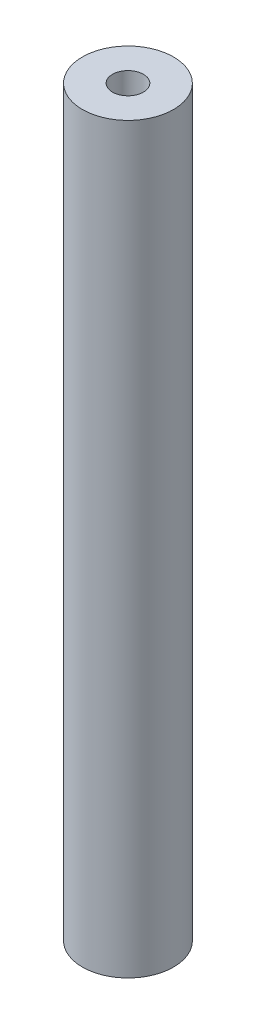
ISO-10303-21;
HEADER;
FILE_DESCRIPTION(('STEP AP214'),'2;1');
FILE_NAME('part.step','',(''),(''),'','','');
FILE_SCHEMA(('AUTOMOTIVE_DESIGN { 1 0 10303 214 1 1 1 1 }'));
ENDSEC;
DATA;
#1=APPLICATION_CONTEXT('core data for automotive mechanical design processes');
#2=APPLICATION_PROTOCOL_DEFINITION('international standard','automotive_design',2000,#1);
#3=PRODUCT_CONTEXT('',#1,'mechanical');
#4=PRODUCT('Part','Part','',(#3));
#5=PRODUCT_RELATED_PRODUCT_CATEGORY('part','',(#4));
#6=PRODUCT_DEFINITION_FORMATION('','',#4);
#7=PRODUCT_DEFINITION_CONTEXT('part definition',#1,'design');
#8=PRODUCT_DEFINITION('design','',#6,#7);
#9=PRODUCT_DEFINITION_SHAPE('','',#8);
#10=(LENGTH_UNIT() NAMED_UNIT(*) SI_UNIT(.MILLI.,.METRE.));
#11=(NAMED_UNIT(*) PLANE_ANGLE_UNIT() SI_UNIT($,.RADIAN.));
#12=(NAMED_UNIT(*) SI_UNIT($,.STERADIAN.) SOLID_ANGLE_UNIT());
#13=UNCERTAINTY_MEASURE_WITH_UNIT(LENGTH_MEASURE(1.E-05),#10,'distance_accuracy_value','');
#14=(GEOMETRIC_REPRESENTATION_CONTEXT(3) GLOBAL_UNCERTAINTY_ASSIGNED_CONTEXT((#13)) GLOBAL_UNIT_ASSIGNED_CONTEXT((#10,
#11,#12)) REPRESENTATION_CONTEXT('',''));
#15=CARTESIAN_POINT('',(0.,0.,0.));
#16=DIRECTION('',(0.,0.,1.));
#17=DIRECTION('',(1.,0.,0.));
#18=AXIS2_PLACEMENT_3D('',#15,#16,#17);
#19=CARTESIAN_POINT('',(0.,240.,0.));
#20=DIRECTION('',(0.,1.,0.));
#21=DIRECTION('',(0.,0.,1.));
#22=AXIS2_PLACEMENT_3D('',#19,#20,#21);
#23=PLANE('',#22);
#24=CARTESIAN_POINT('',(0.,240.,0.));
#25=DIRECTION('',(0.,1.,0.));
#26=DIRECTION('',(0.,0.,1.));
#27=AXIS2_PLACEMENT_3D('',#24,#25,#26);
#28=CIRCLE('',#27,14.725);
#29=CARTESIAN_POINT('',(0.,240.,14.725));
#30=VERTEX_POINT('',#29);
#31=EDGE_CURVE('E10',#30,#30,#28,.T.);
#32=ORIENTED_EDGE('',*,*,#31,.T.);
#33=EDGE_LOOP('',(#32));
#34=FACE_BOUND('',#33,.T.);
#35=CARTESIAN_POINT('',(0.,240.,0.));
#36=DIRECTION('',(0.,1.,0.));
#37=DIRECTION('',(0.,0.,1.));
#38=AXIS2_PLACEMENT_3D('',#35,#36,#37);
#39=CIRCLE('',#38,5.);
#40=CARTESIAN_POINT('',(0.,240.,5.));
#41=VERTEX_POINT('',#40);
#42=EDGE_CURVE('E41',#41,#41,#39,.T.);
#43=ORIENTED_EDGE('',*,*,#42,.F.);
#44=EDGE_LOOP('',(#43));
#45=FACE_BOUND('',#44,.T.);
#46=ADVANCED_FACE('F30',(#34,#45),#23,.T.);
#47=CARTESIAN_POINT('',(0.,0.,0.));
#48=DIRECTION('',(0.,1.,0.));
#49=DIRECTION('',(0.,0.,1.));
#50=AXIS2_PLACEMENT_3D('',#47,#48,#49);
#51=PLANE('',#50);
#52=CARTESIAN_POINT('',(0.,0.,0.));
#53=DIRECTION('',(0.,1.,0.));
#54=DIRECTION('',(0.,0.,1.));
#55=AXIS2_PLACEMENT_3D('',#52,#53,#54);
#56=CIRCLE('',#55,14.725);
#57=CARTESIAN_POINT('',(0.,0.,14.725));
#58=VERTEX_POINT('',#57);
#59=EDGE_CURVE('E34',#58,#58,#56,.T.);
#60=ORIENTED_EDGE('',*,*,#59,.F.);
#61=EDGE_LOOP('',(#60));
#62=FACE_BOUND('',#61,.T.);
#63=CARTESIAN_POINT('',(0.,0.,0.));
#64=DIRECTION('',(0.,1.,0.));
#65=DIRECTION('',(0.,0.,1.));
#66=AXIS2_PLACEMENT_3D('',#63,#64,#65);
#67=CIRCLE('',#66,5.);
#68=CARTESIAN_POINT('',(0.,0.,5.));
#69=VERTEX_POINT('',#68);
#70=EDGE_CURVE('E43',#69,#69,#67,.T.);
#71=ORIENTED_EDGE('',*,*,#70,.T.);
#72=EDGE_LOOP('',(#71));
#73=FACE_BOUND('',#72,.T.);
#74=ADVANCED_FACE('F53',(#62,#73),#51,.F.);
#75=CARTESIAN_POINT('',(0.,240.,0.));
#76=DIRECTION('',(0.,-1.,0.));
#77=DIRECTION('',(0.,0.,-1.));
#78=AXIS2_PLACEMENT_3D('',#75,#76,#77);
#79=CYLINDRICAL_SURFACE('',#78,14.725);
#80=ORIENTED_EDGE('',*,*,#31,.F.);
#81=EDGE_LOOP('',(#80));
#82=FACE_BOUND('',#81,.T.);
#83=ORIENTED_EDGE('',*,*,#59,.T.);
#84=EDGE_LOOP('',(#83));
#85=FACE_BOUND('',#84,.T.);
#86=ADVANCED_FACE('F32',(#82,#85),#79,.T.);
#87=CARTESIAN_POINT('',(0.,240.,0.));
#88=DIRECTION('',(0.,-1.,0.));
#89=DIRECTION('',(0.,0.,-1.));
#90=AXIS2_PLACEMENT_3D('',#87,#88,#89);
#91=CYLINDRICAL_SURFACE('',#90,5.);
#92=ORIENTED_EDGE('',*,*,#42,.T.);
#93=EDGE_LOOP('',(#92));
#94=FACE_BOUND('',#93,.T.);
#95=ORIENTED_EDGE('',*,*,#70,.F.);
#96=EDGE_LOOP('',(#95));
#97=FACE_BOUND('',#96,.T.);
#98=ADVANCED_FACE('F49',(#94,#97),#91,.F.);
#99=CLOSED_SHELL('',(#46,#74,#86,#98));
#100=MANIFOLD_SOLID_BREP('B2',#99);
#101=ADVANCED_BREP_SHAPE_REPRESENTATION('',(#18,#100),#14);
#102=SHAPE_DEFINITION_REPRESENTATION(#9,#101);
ENDSEC;
END-ISO-10303-21;
